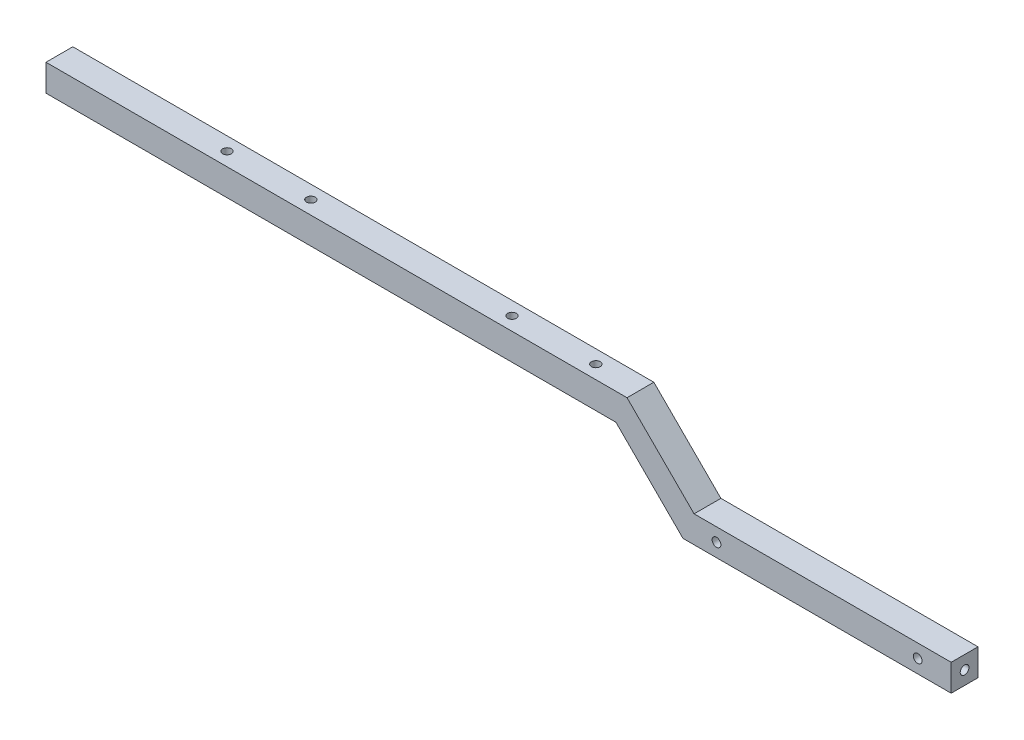
ISO-10303-21;
HEADER;
FILE_DESCRIPTION(('STEP AP214'),'2;1');
FILE_NAME('part.step','',(''),(''),'','','');
FILE_SCHEMA(('AUTOMOTIVE_DESIGN { 1 0 10303 214 1 1 1 1 }'));
ENDSEC;
DATA;
#1=APPLICATION_CONTEXT('core data for automotive mechanical design processes');
#2=APPLICATION_PROTOCOL_DEFINITION('international standard','automotive_design',2000,#1);
#3=PRODUCT_CONTEXT('',#1,'mechanical');
#4=PRODUCT('Part','Part','',(#3));
#5=PRODUCT_RELATED_PRODUCT_CATEGORY('part','',(#4));
#6=PRODUCT_DEFINITION_FORMATION('','',#4);
#7=PRODUCT_DEFINITION_CONTEXT('part definition',#1,'design');
#8=PRODUCT_DEFINITION('design','',#6,#7);
#9=PRODUCT_DEFINITION_SHAPE('','',#8);
#10=(LENGTH_UNIT() NAMED_UNIT(*) SI_UNIT(.MILLI.,.METRE.));
#11=(NAMED_UNIT(*) PLANE_ANGLE_UNIT() SI_UNIT($,.RADIAN.));
#12=(NAMED_UNIT(*) SI_UNIT($,.STERADIAN.) SOLID_ANGLE_UNIT());
#13=UNCERTAINTY_MEASURE_WITH_UNIT(LENGTH_MEASURE(1.E-05),#10,'distance_accuracy_value','');
#14=(GEOMETRIC_REPRESENTATION_CONTEXT(3) GLOBAL_UNCERTAINTY_ASSIGNED_CONTEXT((#13)) GLOBAL_UNIT_ASSIGNED_CONTEXT((#10,
#11,#12)) REPRESENTATION_CONTEXT('',''));
#15=CARTESIAN_POINT('',(0.,0.,0.));
#16=DIRECTION('',(0.,0.,1.));
#17=DIRECTION('',(1.,0.,0.));
#18=AXIS2_PLACEMENT_3D('',#15,#16,#17);
#19=CARTESIAN_POINT('',(-65.,-8.00000000000002,8.));
#20=DIRECTION('',(0.,1.,0.));
#21=DIRECTION('',(-1.,0.,0.));
#22=AXIS2_PLACEMENT_3D('',#19,#20,#21);
#23=PLANE('',#22);
#24=CARTESIAN_POINT('',(55.,-7.99999999999999,4.));
#25=DIRECTION('',(0.,1.,0.));
#26=DIRECTION('',(-1.,0.,0.));
#27=AXIS2_PLACEMENT_3D('',#24,#25,#26);
#28=CIRCLE('',#27,1.29999999999999);
#29=CARTESIAN_POINT('',(53.7,-7.99999999999999,4.));
#30=VERTEX_POINT('',#29);
#31=EDGE_CURVE('E240',#30,#30,#28,.F.);
#32=ORIENTED_EDGE('',*,*,#31,.F.);
#33=EDGE_LOOP('',(#32));
#34=FACE_BOUND('',#33,.T.);
#35=CARTESIAN_POINT('',(30.,-7.99999999999999,4.));
#36=DIRECTION('',(0.,1.,0.));
#37=DIRECTION('',(-1.,0.,0.));
#38=AXIS2_PLACEMENT_3D('',#35,#36,#37);
#39=CIRCLE('',#38,1.29999999999999);
#40=CARTESIAN_POINT('',(28.7,-7.99999999999999,4.));
#41=VERTEX_POINT('',#40);
#42=EDGE_CURVE('E245',#41,#41,#39,.F.);
#43=ORIENTED_EDGE('',*,*,#42,.F.);
#44=EDGE_LOOP('',(#43));
#45=FACE_BOUND('',#44,.T.);
#46=CARTESIAN_POINT('',(-30.,-8.00000000000001,4.00000000000001));
#47=DIRECTION('',(0.,1.,0.));
#48=DIRECTION('',(-1.,0.,0.));
#49=AXIS2_PLACEMENT_3D('',#46,#47,#48);
#50=CIRCLE('',#49,1.29999999999999);
#51=CARTESIAN_POINT('',(-31.3,-8.00000000000001,4.00000000000001));
#52=VERTEX_POINT('',#51);
#53=EDGE_CURVE('E249',#52,#52,#50,.F.);
#54=ORIENTED_EDGE('',*,*,#53,.F.);
#55=EDGE_LOOP('',(#54));
#56=FACE_BOUND('',#55,.T.);
#57=CARTESIAN_POINT('',(-55.,-8.00000000000002,4.00000000000001));
#58=DIRECTION('',(0.,1.,0.));
#59=DIRECTION('',(-1.,0.,0.));
#60=AXIS2_PLACEMENT_3D('',#57,#58,#59);
#61=CIRCLE('',#60,1.30000000000001);
#62=CARTESIAN_POINT('',(-56.3,-8.00000000000002,4.00000000000001));
#63=VERTEX_POINT('',#62);
#64=EDGE_CURVE('E221',#63,#63,#61,.F.);
#65=ORIENTED_EDGE('',*,*,#64,.F.);
#66=EDGE_LOOP('',(#65));
#67=FACE_BOUND('',#66,.T.);
#68=DIRECTION('',(1.,0.,0.));
#69=VECTOR('',#68,1.);
#70=CARTESIAN_POINT('',(-65.,-8.00000000000002,0.));
#71=LINE('',#70,#69);
#72=CARTESIAN_POINT('',(-105.,-8.00000000000003,0.));
#73=VERTEX_POINT('',#72);
#74=CARTESIAN_POINT('',(65.,-7.99999999999998,0.));
#75=VERTEX_POINT('',#74);
#76=EDGE_CURVE('E133',#73,#75,#71,.T.);
#77=ORIENTED_EDGE('',*,*,#76,.T.);
#78=DIRECTION('',(0.,0.,-1.));
#79=VECTOR('',#78,1.);
#80=CARTESIAN_POINT('',(65.,-7.99999999999998,8.));
#81=LINE('',#80,#79);
#82=CARTESIAN_POINT('',(65.,-7.99999999999998,8.));
#83=VERTEX_POINT('',#82);
#84=EDGE_CURVE('E11',#83,#75,#81,.T.);
#85=ORIENTED_EDGE('',*,*,#84,.F.);
#86=DIRECTION('',(1.,0.,0.));
#87=VECTOR('',#86,1.);
#88=CARTESIAN_POINT('',(-65.,-8.00000000000002,8.));
#89=LINE('',#88,#87);
#90=CARTESIAN_POINT('',(-105.,-8.00000000000003,8.));
#91=VERTEX_POINT('',#90);
#92=EDGE_CURVE('E70',#91,#83,#89,.T.);
#93=ORIENTED_EDGE('',*,*,#92,.F.);
#94=DIRECTION('',(0.,0.,1.));
#95=VECTOR('',#94,1.);
#96=CARTESIAN_POINT('',(-105.,-8.00000000000003,0.));
#97=LINE('',#96,#95);
#98=EDGE_CURVE('E138',#73,#91,#97,.T.);
#99=ORIENTED_EDGE('',*,*,#98,.F.);
#100=EDGE_LOOP('',(#77,#85,#93,#99));
#101=FACE_BOUND('',#100,.T.);
#102=ADVANCED_FACE('F50',(#34,#45,#56,#67,#101),#23,.F.);
#103=CARTESIAN_POINT('',(-65.,0.,8.));
#104=DIRECTION('',(0.,-1.,0.));
#105=DIRECTION('',(1.,0.,0.));
#106=AXIS2_PLACEMENT_3D('',#103,#104,#105);
#107=PLANE('',#106);
#108=CARTESIAN_POINT('',(55.,0.,4.));
#109=DIRECTION('',(0.,1.,0.));
#110=DIRECTION('',(-1.,0.,0.));
#111=AXIS2_PLACEMENT_3D('',#108,#109,#110);
#112=CIRCLE('',#111,1.29999999999999);
#113=CARTESIAN_POINT('',(53.7,0.,4.));
#114=VERTEX_POINT('',#113);
#115=EDGE_CURVE('E231',#114,#114,#112,.T.);
#116=ORIENTED_EDGE('',*,*,#115,.F.);
#117=EDGE_LOOP('',(#116));
#118=FACE_BOUND('',#117,.T.);
#119=CARTESIAN_POINT('',(30.,0.,4.));
#120=DIRECTION('',(0.,1.,0.));
#121=DIRECTION('',(-1.,0.,0.));
#122=AXIS2_PLACEMENT_3D('',#119,#120,#121);
#123=CIRCLE('',#122,1.29999999999999);
#124=CARTESIAN_POINT('',(28.7,0.,4.));
#125=VERTEX_POINT('',#124);
#126=EDGE_CURVE('E238',#125,#125,#123,.T.);
#127=ORIENTED_EDGE('',*,*,#126,.F.);
#128=EDGE_LOOP('',(#127));
#129=FACE_BOUND('',#128,.T.);
#130=CARTESIAN_POINT('',(-30.,0.,4.00000000000001));
#131=DIRECTION('',(0.,1.,0.));
#132=DIRECTION('',(1.,0.,0.));
#133=AXIS2_PLACEMENT_3D('',#130,#131,#132);
#134=CIRCLE('',#133,1.29999999999999);
#135=CARTESIAN_POINT('',(-28.7,0.,4.00000000000001));
#136=VERTEX_POINT('',#135);
#137=EDGE_CURVE('E246',#136,#136,#134,.T.);
#138=ORIENTED_EDGE('',*,*,#137,.F.);
#139=EDGE_LOOP('',(#138));
#140=FACE_BOUND('',#139,.T.);
#141=CARTESIAN_POINT('',(-55.,0.,4.00000000000001));
#142=DIRECTION('',(0.,1.,0.));
#143=DIRECTION('',(1.,0.,0.));
#144=AXIS2_PLACEMENT_3D('',#141,#142,#143);
#145=CIRCLE('',#144,1.30000000000001);
#146=CARTESIAN_POINT('',(-53.7,0.,4.00000000000001));
#147=VERTEX_POINT('',#146);
#148=EDGE_CURVE('E251',#147,#147,#145,.T.);
#149=ORIENTED_EDGE('',*,*,#148,.F.);
#150=EDGE_LOOP('',(#149));
#151=FACE_BOUND('',#150,.T.);
#152=DIRECTION('',(-1.,0.,0.));
#153=VECTOR('',#152,1.);
#154=CARTESIAN_POINT('',(-65.,0.,0.));
#155=LINE('',#154,#153);
#156=CARTESIAN_POINT('',(68.3137084989848,0.,0.));
#157=VERTEX_POINT('',#156);
#158=CARTESIAN_POINT('',(-105.,0.,0.));
#159=VERTEX_POINT('',#158);
#160=EDGE_CURVE('E118',#157,#159,#155,.T.);
#161=ORIENTED_EDGE('',*,*,#160,.T.);
#162=DIRECTION('',(0.,0.,1.));
#163=VECTOR('',#162,1.);
#164=CARTESIAN_POINT('',(-105.,0.,0.));
#165=LINE('',#164,#163);
#166=CARTESIAN_POINT('',(-105.,0.,8.));
#167=VERTEX_POINT('',#166);
#168=EDGE_CURVE('E125',#159,#167,#165,.T.);
#169=ORIENTED_EDGE('',*,*,#168,.T.);
#170=DIRECTION('',(-1.,0.,0.));
#171=VECTOR('',#170,1.);
#172=CARTESIAN_POINT('',(-65.,0.,8.));
#173=LINE('',#172,#171);
#174=CARTESIAN_POINT('',(68.3137084989848,0.,8.));
#175=VERTEX_POINT('',#174);
#176=EDGE_CURVE('E54',#175,#167,#173,.T.);
#177=ORIENTED_EDGE('',*,*,#176,.F.);
#178=DIRECTION('',(0.,0.,-1.));
#179=VECTOR('',#178,1.);
#180=CARTESIAN_POINT('',(68.3137084989848,0.,8.));
#181=LINE('',#180,#179);
#182=EDGE_CURVE('E123',#175,#157,#181,.T.);
#183=ORIENTED_EDGE('',*,*,#182,.T.);
#184=EDGE_LOOP('',(#161,#169,#177,#183));
#185=FACE_BOUND('',#184,.T.);
#186=ADVANCED_FACE('F122',(#118,#129,#140,#151,#185),#107,.F.);
#187=CARTESIAN_POINT('',(0.,0.,8.));
#188=DIRECTION('',(0.,0.,1.));
#189=DIRECTION('',(1.,0.,0.));
#190=AXIS2_PLACEMENT_3D('',#187,#188,#189);
#191=PLANE('',#190);
#192=CARTESIAN_POINT('',(95.,-24.0000000000001,8.));
#193=DIRECTION('',(0.,0.,1.));
#194=DIRECTION('',(1.,0.,0.));
#195=AXIS2_PLACEMENT_3D('',#192,#193,#194);
#196=CIRCLE('',#195,1.29999999999999);
#197=CARTESIAN_POINT('',(96.3,-24.0000000000001,8.));
#198=VERTEX_POINT('',#197);
#199=EDGE_CURVE('E159',#198,#198,#196,.F.);
#200=ORIENTED_EDGE('',*,*,#199,.T.);
#201=EDGE_LOOP('',(#200));
#202=FACE_BOUND('',#201,.T.);
#203=CARTESIAN_POINT('',(155.,-24.0000000000001,8.));
#204=DIRECTION('',(0.,0.,1.));
#205=DIRECTION('',(1.,0.,0.));
#206=AXIS2_PLACEMENT_3D('',#203,#204,#205);
#207=CIRCLE('',#206,1.30000000000001);
#208=CARTESIAN_POINT('',(156.3,-24.0000000000001,8.));
#209=VERTEX_POINT('',#208);
#210=EDGE_CURVE('E165',#209,#209,#207,.F.);
#211=ORIENTED_EDGE('',*,*,#210,.T.);
#212=EDGE_LOOP('',(#211));
#213=FACE_BOUND('',#212,.T.);
#214=ORIENTED_EDGE('',*,*,#92,.T.);
#215=DIRECTION('',(-0.707106781186546,0.707106781186549,0.));
#216=VECTOR('',#215,1.);
#217=CARTESIAN_POINT('',(65.,-7.99999999999998,8.));
#218=LINE('',#217,#216);
#219=CARTESIAN_POINT('',(85.,-28.0000000000001,8.));
#220=VERTEX_POINT('',#219);
#221=EDGE_CURVE('E197',#220,#83,#218,.T.);
#222=ORIENTED_EDGE('',*,*,#221,.F.);
#223=DIRECTION('',(-1.,0.,0.));
#224=VECTOR('',#223,1.);
#225=CARTESIAN_POINT('',(85.,-28.0000000000001,8.));
#226=LINE('',#225,#224);
#227=CARTESIAN_POINT('',(165.,-28.0000000000001,8.));
#228=VERTEX_POINT('',#227);
#229=EDGE_CURVE('E193',#228,#220,#226,.T.);
#230=ORIENTED_EDGE('',*,*,#229,.F.);
#231=DIRECTION('',(0.,-1.,0.));
#232=VECTOR('',#231,1.);
#233=CARTESIAN_POINT('',(165.,-28.0000000000001,8.));
#234=LINE('',#233,#232);
#235=CARTESIAN_POINT('',(165.,-20.0000000000001,8.));
#236=VERTEX_POINT('',#235);
#237=EDGE_CURVE('E188',#236,#228,#234,.T.);
#238=ORIENTED_EDGE('',*,*,#237,.F.);
#239=DIRECTION('',(1.,0.,0.));
#240=VECTOR('',#239,1.);
#241=CARTESIAN_POINT('',(165.,-20.0000000000001,8.));
#242=LINE('',#241,#240);
#243=CARTESIAN_POINT('',(88.3137084989848,-20.0000000000001,8.));
#244=VERTEX_POINT('',#243);
#245=EDGE_CURVE('E184',#244,#236,#242,.T.);
#246=ORIENTED_EDGE('',*,*,#245,.F.);
#247=DIRECTION('',(0.707106781186546,-0.707106781186549,0.));
#248=VECTOR('',#247,1.);
#249=CARTESIAN_POINT('',(88.3137084989848,-20.0000000000001,8.));
#250=LINE('',#249,#248);
#251=EDGE_CURVE('E181',#175,#244,#250,.T.);
#252=ORIENTED_EDGE('',*,*,#251,.F.);
#253=ORIENTED_EDGE('',*,*,#176,.T.);
#254=DIRECTION('',(0.,-1.,0.));
#255=VECTOR('',#254,1.);
#256=CARTESIAN_POINT('',(-105.,-8.00000000000003,8.));
#257=LINE('',#256,#255);
#258=EDGE_CURVE('E140',#167,#91,#257,.T.);
#259=ORIENTED_EDGE('',*,*,#258,.T.);
#260=EDGE_LOOP('',(#214,#222,#230,#238,#246,#252,#253,#259));
#261=FACE_BOUND('',#260,.T.);
#262=ADVANCED_FACE('F278',(#202,#213,#261),#191,.T.);
#263=CARTESIAN_POINT('',(0.,0.,0.));
#264=DIRECTION('',(0.,0.,1.));
#265=DIRECTION('',(1.,0.,0.));
#266=AXIS2_PLACEMENT_3D('',#263,#264,#265);
#267=PLANE('',#266);
#268=CARTESIAN_POINT('',(95.,-24.0000000000001,0.));
#269=DIRECTION('',(0.,0.,-1.));
#270=DIRECTION('',(-1.,0.,0.));
#271=AXIS2_PLACEMENT_3D('',#268,#269,#270);
#272=CIRCLE('',#271,1.29999999999999);
#273=CARTESIAN_POINT('',(93.7,-24.0000000000001,0.));
#274=VERTEX_POINT('',#273);
#275=EDGE_CURVE('E151',#274,#274,#272,.T.);
#276=ORIENTED_EDGE('',*,*,#275,.F.);
#277=EDGE_LOOP('',(#276));
#278=FACE_BOUND('',#277,.T.);
#279=CARTESIAN_POINT('',(155.,-24.0000000000001,0.));
#280=DIRECTION('',(0.,0.,-1.));
#281=DIRECTION('',(1.,0.,0.));
#282=AXIS2_PLACEMENT_3D('',#279,#280,#281);
#283=CIRCLE('',#282,1.30000000000001);
#284=CARTESIAN_POINT('',(156.3,-24.0000000000001,0.));
#285=VERTEX_POINT('',#284);
#286=EDGE_CURVE('E166',#285,#285,#283,.T.);
#287=ORIENTED_EDGE('',*,*,#286,.F.);
#288=EDGE_LOOP('',(#287));
#289=FACE_BOUND('',#288,.T.);
#290=ORIENTED_EDGE('',*,*,#76,.F.);
#291=DIRECTION('',(0.,-1.,0.));
#292=VECTOR('',#291,1.);
#293=CARTESIAN_POINT('',(-105.,-8.00000000000003,0.));
#294=LINE('',#293,#292);
#295=EDGE_CURVE('E136',#159,#73,#294,.T.);
#296=ORIENTED_EDGE('',*,*,#295,.F.);
#297=ORIENTED_EDGE('',*,*,#160,.F.);
#298=DIRECTION('',(0.707106781186546,-0.707106781186549,0.));
#299=VECTOR('',#298,1.);
#300=CARTESIAN_POINT('',(88.3137084989848,-20.0000000000001,0.));
#301=LINE('',#300,#299);
#302=CARTESIAN_POINT('',(88.3137084989848,-20.0000000000001,0.));
#303=VERTEX_POINT('',#302);
#304=EDGE_CURVE('E179',#157,#303,#301,.T.);
#305=ORIENTED_EDGE('',*,*,#304,.T.);
#306=DIRECTION('',(1.,0.,0.));
#307=VECTOR('',#306,1.);
#308=CARTESIAN_POINT('',(165.,-20.0000000000001,0.));
#309=LINE('',#308,#307);
#310=CARTESIAN_POINT('',(165.,-20.0000000000001,0.));
#311=VERTEX_POINT('',#310);
#312=EDGE_CURVE('E203',#303,#311,#309,.T.);
#313=ORIENTED_EDGE('',*,*,#312,.T.);
#314=DIRECTION('',(0.,-1.,0.));
#315=VECTOR('',#314,1.);
#316=CARTESIAN_POINT('',(165.,-28.0000000000001,0.));
#317=LINE('',#316,#315);
#318=CARTESIAN_POINT('',(165.,-28.0000000000001,0.));
#319=VERTEX_POINT('',#318);
#320=EDGE_CURVE('E206',#311,#319,#317,.T.);
#321=ORIENTED_EDGE('',*,*,#320,.T.);
#322=DIRECTION('',(-1.,0.,0.));
#323=VECTOR('',#322,1.);
#324=CARTESIAN_POINT('',(85.,-28.0000000000001,0.));
#325=LINE('',#324,#323);
#326=CARTESIAN_POINT('',(85.,-28.0000000000001,0.));
#327=VERTEX_POINT('',#326);
#328=EDGE_CURVE('E211',#319,#327,#325,.T.);
#329=ORIENTED_EDGE('',*,*,#328,.T.);
#330=DIRECTION('',(-0.707106781186546,0.707106781186549,0.));
#331=VECTOR('',#330,1.);
#332=CARTESIAN_POINT('',(65.,-7.99999999999998,0.));
#333=LINE('',#332,#331);
#334=EDGE_CURVE('E187',#327,#75,#333,.T.);
#335=ORIENTED_EDGE('',*,*,#334,.T.);
#336=EDGE_LOOP('',(#290,#296,#297,#305,#313,#321,#329,#335));
#337=FACE_BOUND('',#336,.T.);
#338=ADVANCED_FACE('F142',(#278,#289,#337),#267,.F.);
#339=CARTESIAN_POINT('',(-55.,-8.00100000000006,4.00000000000001));
#340=DIRECTION('',(0.,1.,0.));
#341=DIRECTION('',(-1.,0.,0.));
#342=AXIS2_PLACEMENT_3D('',#339,#340,#341);
#343=CYLINDRICAL_SURFACE('',#342,1.30000000000001);
#344=ORIENTED_EDGE('',*,*,#148,.T.);
#345=EDGE_LOOP('',(#344));
#346=FACE_BOUND('',#345,.T.);
#347=ORIENTED_EDGE('',*,*,#64,.T.);
#348=EDGE_LOOP('',(#347));
#349=FACE_BOUND('',#348,.T.);
#350=ADVANCED_FACE('F290',(#346,#349),#343,.F.);
#351=CARTESIAN_POINT('',(-30.,-8.00100000000005,4.00000000000001));
#352=DIRECTION('',(0.,1.,0.));
#353=DIRECTION('',(-1.,0.,0.));
#354=AXIS2_PLACEMENT_3D('',#351,#352,#353);
#355=CYLINDRICAL_SURFACE('',#354,1.29999999999999);
#356=ORIENTED_EDGE('',*,*,#137,.T.);
#357=EDGE_LOOP('',(#356));
#358=FACE_BOUND('',#357,.T.);
#359=ORIENTED_EDGE('',*,*,#53,.T.);
#360=EDGE_LOOP('',(#359));
#361=FACE_BOUND('',#360,.T.);
#362=ADVANCED_FACE('F310',(#358,#361),#355,.F.);
#363=CARTESIAN_POINT('',(30.,-8.00100000000003,4.));
#364=DIRECTION('',(0.,1.,0.));
#365=DIRECTION('',(-1.,0.,0.));
#366=AXIS2_PLACEMENT_3D('',#363,#364,#365);
#367=CYLINDRICAL_SURFACE('',#366,1.29999999999999);
#368=ORIENTED_EDGE('',*,*,#126,.T.);
#369=EDGE_LOOP('',(#368));
#370=FACE_BOUND('',#369,.T.);
#371=ORIENTED_EDGE('',*,*,#42,.T.);
#372=EDGE_LOOP('',(#371));
#373=FACE_BOUND('',#372,.T.);
#374=ADVANCED_FACE('F315',(#370,#373),#367,.F.);
#375=CARTESIAN_POINT('',(55.,-8.00100000000002,4.));
#376=DIRECTION('',(0.,1.,0.));
#377=DIRECTION('',(-1.,0.,0.));
#378=AXIS2_PLACEMENT_3D('',#375,#376,#377);
#379=CYLINDRICAL_SURFACE('',#378,1.29999999999999);
#380=ORIENTED_EDGE('',*,*,#115,.T.);
#381=EDGE_LOOP('',(#380));
#382=FACE_BOUND('',#381,.T.);
#383=ORIENTED_EDGE('',*,*,#31,.T.);
#384=EDGE_LOOP('',(#383));
#385=FACE_BOUND('',#384,.T.);
#386=ADVANCED_FACE('F319',(#382,#385),#379,.F.);
#387=CARTESIAN_POINT('',(65.,-7.99999999999998,8.));
#388=DIRECTION('',(-0.707106781186549,-0.707106781186546,0.));
#389=DIRECTION('',(0.707106781186546,-0.707106781186549,0.));
#390=AXIS2_PLACEMENT_3D('',#387,#388,#389);
#391=PLANE('',#390);
#392=ORIENTED_EDGE('',*,*,#334,.F.);
#393=DIRECTION('',(0.,0.,-1.));
#394=VECTOR('',#393,1.);
#395=CARTESIAN_POINT('',(85.,-28.0000000000001,8.));
#396=LINE('',#395,#394);
#397=EDGE_CURVE('E217',#220,#327,#396,.T.);
#398=ORIENTED_EDGE('',*,*,#397,.F.);
#399=ORIENTED_EDGE('',*,*,#221,.T.);
#400=ORIENTED_EDGE('',*,*,#84,.T.);
#401=EDGE_LOOP('',(#392,#398,#399,#400));
#402=FACE_BOUND('',#401,.T.);
#403=ADVANCED_FACE('F275',(#402),#391,.T.);
#404=CARTESIAN_POINT('',(85.,-28.0000000000001,8.));
#405=DIRECTION('',(0.,-1.,0.));
#406=DIRECTION('',(0.,0.,-1.));
#407=AXIS2_PLACEMENT_3D('',#404,#405,#406);
#408=PLANE('',#407);
#409=ORIENTED_EDGE('',*,*,#328,.F.);
#410=DIRECTION('',(0.,0.,-1.));
#411=VECTOR('',#410,1.);
#412=CARTESIAN_POINT('',(165.,-28.0000000000001,8.));
#413=LINE('',#412,#411);
#414=EDGE_CURVE('E225',#228,#319,#413,.T.);
#415=ORIENTED_EDGE('',*,*,#414,.F.);
#416=ORIENTED_EDGE('',*,*,#229,.T.);
#417=ORIENTED_EDGE('',*,*,#397,.T.);
#418=EDGE_LOOP('',(#409,#415,#416,#417));
#419=FACE_BOUND('',#418,.T.);
#420=ADVANCED_FACE('F279',(#419),#408,.T.);
#421=CARTESIAN_POINT('',(165.,-28.0000000000001,8.));
#422=DIRECTION('',(1.,0.,0.));
#423=DIRECTION('',(0.,0.,-1.));
#424=AXIS2_PLACEMENT_3D('',#421,#422,#423);
#425=PLANE('',#424);
#426=CARTESIAN_POINT('',(165.,-24.,4.));
#427=DIRECTION('',(1.,0.,0.));
#428=DIRECTION('',(0.,0.,-1.));
#429=AXIS2_PLACEMENT_3D('',#426,#427,#428);
#430=CIRCLE('',#429,1.30000000000054);
#431=CARTESIAN_POINT('',(165.,-24.,2.69999999999946));
#432=VERTEX_POINT('',#431);
#433=EDGE_CURVE('E158',#432,#432,#430,.T.);
#434=ORIENTED_EDGE('',*,*,#433,.F.);
#435=EDGE_LOOP('',(#434));
#436=FACE_BOUND('',#435,.T.);
#437=ORIENTED_EDGE('',*,*,#320,.F.);
#438=DIRECTION('',(0.,0.,-1.));
#439=VECTOR('',#438,1.);
#440=CARTESIAN_POINT('',(165.,-20.0000000000001,8.));
#441=LINE('',#440,#439);
#442=EDGE_CURVE('E224',#236,#311,#441,.T.);
#443=ORIENTED_EDGE('',*,*,#442,.F.);
#444=ORIENTED_EDGE('',*,*,#237,.T.);
#445=ORIENTED_EDGE('',*,*,#414,.T.);
#446=EDGE_LOOP('',(#437,#443,#444,#445));
#447=FACE_BOUND('',#446,.T.);
#448=ADVANCED_FACE('F331',(#436,#447),#425,.T.);
#449=CARTESIAN_POINT('',(165.,-20.0000000000001,8.));
#450=DIRECTION('',(0.,1.,0.));
#451=DIRECTION('',(-1.,0.,0.));
#452=AXIS2_PLACEMENT_3D('',#449,#450,#451);
#453=PLANE('',#452);
#454=ORIENTED_EDGE('',*,*,#312,.F.);
#455=DIRECTION('',(0.,0.,-1.));
#456=VECTOR('',#455,1.);
#457=CARTESIAN_POINT('',(88.3137084989848,-20.0000000000001,8.));
#458=LINE('',#457,#456);
#459=EDGE_CURVE('E226',#244,#303,#458,.T.);
#460=ORIENTED_EDGE('',*,*,#459,.F.);
#461=ORIENTED_EDGE('',*,*,#245,.T.);
#462=ORIENTED_EDGE('',*,*,#442,.T.);
#463=EDGE_LOOP('',(#454,#460,#461,#462));
#464=FACE_BOUND('',#463,.T.);
#465=ADVANCED_FACE('F329',(#464),#453,.T.);
#466=CARTESIAN_POINT('',(88.3137084989848,-20.0000000000001,8.));
#467=DIRECTION('',(0.707106781186549,0.707106781186546,0.));
#468=DIRECTION('',(-0.707106781186546,0.707106781186549,0.));
#469=AXIS2_PLACEMENT_3D('',#466,#467,#468);
#470=PLANE('',#469);
#471=ORIENTED_EDGE('',*,*,#304,.F.);
#472=ORIENTED_EDGE('',*,*,#182,.F.);
#473=ORIENTED_EDGE('',*,*,#251,.T.);
#474=ORIENTED_EDGE('',*,*,#459,.T.);
#475=EDGE_LOOP('',(#471,#472,#473,#474));
#476=FACE_BOUND('',#475,.T.);
#477=ADVANCED_FACE('F325',(#476),#470,.T.);
#478=CARTESIAN_POINT('',(155.,-24.,4.));
#479=DIRECTION('',(1.,0.,0.));
#480=DIRECTION('',(0.,0.,-1.));
#481=AXIS2_PLACEMENT_3D('',#478,#479,#480);
#482=CYLINDRICAL_SURFACE('',#481,1.30000000000054);
#483=CARTESIAN_POINT('',(155.,-24.0000000000001,4.));
#484=DIRECTION('',(-0.707106781186547,0.,-0.707106781186547));
#485=DIRECTION('',(0.707106781186547,0.,-0.707106781186547));
#486=AXIS2_PLACEMENT_3D('',#483,#484,#485);
#487=ELLIPSE('',#486,1.83847763108541,1.30000000000027);
#488=CARTESIAN_POINT('',(155.,-25.3000000000005,4.));
#489=VERTEX_POINT('',#488);
#490=CARTESIAN_POINT('',(155.,-22.7000000000001,4.));
#491=VERTEX_POINT('',#490);
#492=EDGE_CURVE('E171',#489,#491,#487,.F.);
#493=ORIENTED_EDGE('',*,*,#492,.F.);
#494=CARTESIAN_POINT('',(155.,-24.0000000000001,4.));
#495=DIRECTION('',(0.707106781186547,0.,-0.707106781186547));
#496=DIRECTION('',(-0.707106781186547,0.,-0.707106781186547));
#497=AXIS2_PLACEMENT_3D('',#494,#495,#496);
#498=ELLIPSE('',#497,1.83847763108541,1.30000000000027);
#499=EDGE_CURVE('E64',#491,#489,#498,.T.);
#500=ORIENTED_EDGE('',*,*,#499,.F.);
#501=EDGE_LOOP('',(#493,#500));
#502=FACE_BOUND('',#501,.T.);
#503=ORIENTED_EDGE('',*,*,#433,.T.);
#504=EDGE_LOOP('',(#503));
#505=FACE_BOUND('',#504,.T.);
#506=ADVANCED_FACE('F328',(#502,#505),#482,.F.);
#507=CARTESIAN_POINT('',(155.,-24.0000000000001,8.001));
#508=DIRECTION('',(0.,0.,-1.));
#509=DIRECTION('',(-1.,0.,0.));
#510=AXIS2_PLACEMENT_3D('',#507,#508,#509);
#511=CYLINDRICAL_SURFACE('',#510,1.30000000000001);
#512=ORIENTED_EDGE('',*,*,#210,.F.);
#513=EDGE_LOOP('',(#512));
#514=FACE_BOUND('',#513,.T.);
#515=ORIENTED_EDGE('',*,*,#286,.T.);
#516=EDGE_LOOP('',(#515));
#517=FACE_BOUND('',#516,.T.);
#518=ORIENTED_EDGE('',*,*,#499,.T.);
#519=ORIENTED_EDGE('',*,*,#492,.T.);
#520=EDGE_LOOP('',(#518,#519));
#521=FACE_BOUND('',#520,.T.);
#522=ADVANCED_FACE('F341',(#514,#517,#521),#511,.F.);
#523=CARTESIAN_POINT('',(95.,-24.0000000000001,8.001));
#524=DIRECTION('',(0.,0.,-1.));
#525=DIRECTION('',(-1.,0.,0.));
#526=AXIS2_PLACEMENT_3D('',#523,#524,#525);
#527=CYLINDRICAL_SURFACE('',#526,1.29999999999999);
#528=ORIENTED_EDGE('',*,*,#199,.F.);
#529=EDGE_LOOP('',(#528));
#530=FACE_BOUND('',#529,.T.);
#531=ORIENTED_EDGE('',*,*,#275,.T.);
#532=EDGE_LOOP('',(#531));
#533=FACE_BOUND('',#532,.T.);
#534=ADVANCED_FACE('F348',(#530,#533),#527,.F.);
#535=CARTESIAN_POINT('',(-105.,-8.00000000000003,0.));
#536=DIRECTION('',(-1.,0.,0.));
#537=DIRECTION('',(0.,0.,1.));
#538=AXIS2_PLACEMENT_3D('',#535,#536,#537);
#539=PLANE('',#538);
#540=CARTESIAN_POINT('',(-105.,-4.00000000000002,4.));
#541=DIRECTION('',(-1.,0.,0.));
#542=DIRECTION('',(0.,0.,1.));
#543=AXIS2_PLACEMENT_3D('',#540,#541,#542);
#544=CIRCLE('',#543,1.3);
#545=CARTESIAN_POINT('',(-105.,-4.00000000000002,5.3));
#546=VERTEX_POINT('',#545);
#547=EDGE_CURVE('E147',#546,#546,#544,.T.);
#548=ORIENTED_EDGE('',*,*,#547,.F.);
#549=EDGE_LOOP('',(#548));
#550=FACE_BOUND('',#549,.T.);
#551=ORIENTED_EDGE('',*,*,#258,.F.);
#552=ORIENTED_EDGE('',*,*,#168,.F.);
#553=ORIENTED_EDGE('',*,*,#295,.T.);
#554=ORIENTED_EDGE('',*,*,#98,.T.);
#555=EDGE_LOOP('',(#551,#552,#553,#554));
#556=FACE_BOUND('',#555,.T.);
#557=ADVANCED_FACE('F135',(#550,#556),#539,.T.);
#558=CARTESIAN_POINT('',(-95.,-4.00000000000002,4.));
#559=DIRECTION('',(-1.,0.,0.));
#560=DIRECTION('',(0.,0.,1.));
#561=AXIS2_PLACEMENT_3D('',#558,#559,#560);
#562=CYLINDRICAL_SURFACE('',#561,1.3);
#563=CARTESIAN_POINT('',(-95.,-4.00000000000002,4.));
#564=DIRECTION('',(-1.,0.,0.));
#565=DIRECTION('',(0.,0.,1.));
#566=AXIS2_PLACEMENT_3D('',#563,#564,#565);
#567=CIRCLE('',#566,1.3);
#568=CARTESIAN_POINT('',(-95.,-4.00000000000002,5.3));
#569=VERTEX_POINT('',#568);
#570=EDGE_CURVE('E146',#569,#569,#567,.T.);
#571=ORIENTED_EDGE('',*,*,#570,.F.);
#572=EDGE_LOOP('',(#571));
#573=FACE_BOUND('',#572,.T.);
#574=ORIENTED_EDGE('',*,*,#547,.T.);
#575=EDGE_LOOP('',(#574));
#576=FACE_BOUND('',#575,.T.);
#577=ADVANCED_FACE('F355',(#573,#576),#562,.F.);
#578=CARTESIAN_POINT('',(-95.,-4.00000000000002,4.));
#579=DIRECTION('',(-1.,0.,0.));
#580=DIRECTION('',(0.,0.,1.));
#581=AXIS2_PLACEMENT_3D('',#578,#579,#580);
#582=PLANE('',#581);
#583=ORIENTED_EDGE('',*,*,#570,.T.);
#584=EDGE_LOOP('',(#583));
#585=FACE_BOUND('',#584,.T.);
#586=ADVANCED_FACE('F358',(#585),#582,.T.);
#587=CLOSED_SHELL('',(#102,#186,#262,#338,#350,#362,#374,#386,#403,#420,#448,#465,#477,#506,
#522,#534,#557,#577,#586));
#588=MANIFOLD_SOLID_BREP('B2',#587);
#589=ADVANCED_BREP_SHAPE_REPRESENTATION('',(#18,#588),#14);
#590=SHAPE_DEFINITION_REPRESENTATION(#9,#589);
ENDSEC;
END-ISO-10303-21;
